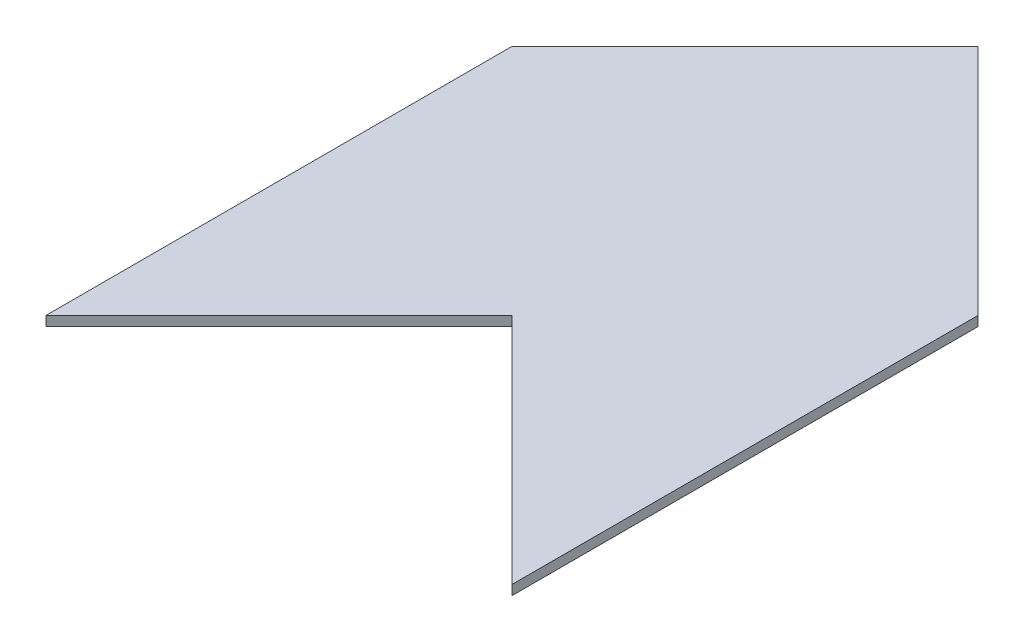
ISO-10303-21;
HEADER;
FILE_DESCRIPTION(('STEP AP214'),'2;1');
FILE_NAME('part.step','',(''),(''),'','','');
FILE_SCHEMA(('AUTOMOTIVE_DESIGN { 1 0 10303 214 1 1 1 1 }'));
ENDSEC;
DATA;
#1=APPLICATION_CONTEXT('core data for automotive mechanical design processes');
#2=APPLICATION_PROTOCOL_DEFINITION('international standard','automotive_design',2000,#1);
#3=PRODUCT_CONTEXT('',#1,'mechanical');
#4=PRODUCT('Part','Part','',(#3));
#5=PRODUCT_RELATED_PRODUCT_CATEGORY('part','',(#4));
#6=PRODUCT_DEFINITION_FORMATION('','',#4);
#7=PRODUCT_DEFINITION_CONTEXT('part definition',#1,'design');
#8=PRODUCT_DEFINITION('design','',#6,#7);
#9=PRODUCT_DEFINITION_SHAPE('','',#8);
#10=(LENGTH_UNIT() NAMED_UNIT(*) SI_UNIT(.MILLI.,.METRE.));
#11=(NAMED_UNIT(*) PLANE_ANGLE_UNIT() SI_UNIT($,.RADIAN.));
#12=(NAMED_UNIT(*) SI_UNIT($,.STERADIAN.) SOLID_ANGLE_UNIT());
#13=UNCERTAINTY_MEASURE_WITH_UNIT(LENGTH_MEASURE(1.E-05),#10,'distance_accuracy_value','');
#14=(GEOMETRIC_REPRESENTATION_CONTEXT(3) GLOBAL_UNCERTAINTY_ASSIGNED_CONTEXT((#13)) GLOBAL_UNIT_ASSIGNED_CONTEXT((#10,
#11,#12)) REPRESENTATION_CONTEXT('',''));
#15=CARTESIAN_POINT('',(0.,0.,0.));
#16=DIRECTION('',(0.,0.,1.));
#17=DIRECTION('',(1.,0.,0.));
#18=AXIS2_PLACEMENT_3D('',#15,#16,#17);
#19=CARTESIAN_POINT('',(0.,3.175,0.));
#20=DIRECTION('',(-0.707106781186548,0.,-0.707106781186548));
#21=DIRECTION('',(-0.707106781186548,0.,0.707106781186548));
#22=AXIS2_PLACEMENT_3D('',#19,#20,#21);
#23=PLANE('',#22);
#24=DIRECTION('',(0.707106781186547,0.,-0.707106781186547));
#25=VECTOR('',#24,1.);
#26=CARTESIAN_POINT('',(0.,0.,0.));
#27=LINE('',#26,#25);
#28=CARTESIAN_POINT('',(-76.2,0.,76.2));
#29=VERTEX_POINT('',#28);
#30=CARTESIAN_POINT('',(0.,0.,0.));
#31=VERTEX_POINT('',#30);
#32=EDGE_CURVE('E116',#29,#31,#27,.T.);
#33=ORIENTED_EDGE('',*,*,#32,.T.);
#34=DIRECTION('',(0.,-1.,0.));
#35=VECTOR('',#34,1.);
#36=CARTESIAN_POINT('',(0.,3.175,0.));
#37=LINE('',#36,#35);
#38=CARTESIAN_POINT('',(0.,3.175,0.));
#39=VERTEX_POINT('',#38);
#40=EDGE_CURVE('E11',#39,#31,#37,.T.);
#41=ORIENTED_EDGE('',*,*,#40,.F.);
#42=DIRECTION('',(0.707106781186547,0.,-0.707106781186547));
#43=VECTOR('',#42,1.);
#44=CARTESIAN_POINT('',(0.,3.175,0.));
#45=LINE('',#44,#43);
#46=CARTESIAN_POINT('',(-76.2,3.175,76.2));
#47=VERTEX_POINT('',#46);
#48=EDGE_CURVE('E126',#47,#39,#45,.T.);
#49=ORIENTED_EDGE('',*,*,#48,.F.);
#50=DIRECTION('',(0.,-1.,0.));
#51=VECTOR('',#50,1.);
#52=CARTESIAN_POINT('',(-76.2,3.175,76.2));
#53=LINE('',#52,#51);
#54=EDGE_CURVE('E112',#47,#29,#53,.T.);
#55=ORIENTED_EDGE('',*,*,#54,.T.);
#56=EDGE_LOOP('',(#33,#41,#49,#55));
#57=FACE_BOUND('',#56,.T.);
#58=ADVANCED_FACE('F32',(#57),#23,.F.);
#59=CARTESIAN_POINT('',(0.,3.175,0.));
#60=DIRECTION('',(0.707106781186548,0.,-0.707106781186548));
#61=DIRECTION('',(-0.707106781186548,0.,-0.707106781186548));
#62=AXIS2_PLACEMENT_3D('',#59,#60,#61);
#63=PLANE('',#62);
#64=DIRECTION('',(0.707106781186547,0.,0.707106781186547));
#65=VECTOR('',#64,1.);
#66=CARTESIAN_POINT('',(0.,0.,0.));
#67=LINE('',#66,#65);
#68=CARTESIAN_POINT('',(76.2,0.,76.2));
#69=VERTEX_POINT('',#68);
#70=EDGE_CURVE('E119',#31,#69,#67,.T.);
#71=ORIENTED_EDGE('',*,*,#70,.T.);
#72=DIRECTION('',(0.,-1.,0.));
#73=VECTOR('',#72,1.);
#74=CARTESIAN_POINT('',(76.2,3.175,76.2));
#75=LINE('',#74,#73);
#76=CARTESIAN_POINT('',(76.2,3.175,76.2));
#77=VERTEX_POINT('',#76);
#78=EDGE_CURVE('E40',#77,#69,#75,.T.);
#79=ORIENTED_EDGE('',*,*,#78,.F.);
#80=DIRECTION('',(0.707106781186547,0.,0.707106781186547));
#81=VECTOR('',#80,1.);
#82=CARTESIAN_POINT('',(0.,3.175,0.));
#83=LINE('',#82,#81);
#84=EDGE_CURVE('E85',#39,#77,#83,.T.);
#85=ORIENTED_EDGE('',*,*,#84,.F.);
#86=ORIENTED_EDGE('',*,*,#40,.T.);
#87=EDGE_LOOP('',(#71,#79,#85,#86));
#88=FACE_BOUND('',#87,.T.);
#89=ADVANCED_FACE('F150',(#88),#63,.F.);
#90=CARTESIAN_POINT('',(76.2,3.175,76.2));
#91=DIRECTION('',(-1.,0.,0.));
#92=DIRECTION('',(0.,0.,1.));
#93=AXIS2_PLACEMENT_3D('',#90,#91,#92);
#94=PLANE('',#93);
#95=DIRECTION('',(0.,0.,-1.));
#96=VECTOR('',#95,1.);
#97=CARTESIAN_POINT('',(76.2,0.,76.2));
#98=LINE('',#97,#96);
#99=CARTESIAN_POINT('',(76.2,0.,-76.2));
#100=VERTEX_POINT('',#99);
#101=EDGE_CURVE('E121',#69,#100,#98,.T.);
#102=ORIENTED_EDGE('',*,*,#101,.T.);
#103=DIRECTION('',(0.,-1.,0.));
#104=VECTOR('',#103,1.);
#105=CARTESIAN_POINT('',(76.2,3.175,-76.2));
#106=LINE('',#105,#104);
#107=CARTESIAN_POINT('',(76.2,3.175,-76.2));
#108=VERTEX_POINT('',#107);
#109=EDGE_CURVE('E107',#108,#100,#106,.T.);
#110=ORIENTED_EDGE('',*,*,#109,.F.);
#111=DIRECTION('',(0.,0.,-1.));
#112=VECTOR('',#111,1.);
#113=CARTESIAN_POINT('',(76.2,3.175,76.2));
#114=LINE('',#113,#112);
#115=EDGE_CURVE('E98',#77,#108,#114,.T.);
#116=ORIENTED_EDGE('',*,*,#115,.F.);
#117=ORIENTED_EDGE('',*,*,#78,.T.);
#118=EDGE_LOOP('',(#102,#110,#116,#117));
#119=FACE_BOUND('',#118,.T.);
#120=ADVANCED_FACE('F132',(#119),#94,.F.);
#121=CARTESIAN_POINT('',(76.2,3.175,-76.2));
#122=DIRECTION('',(-0.707106781186548,0.,0.707106781186548));
#123=DIRECTION('',(0.707106781186547,0.,0.707106781186548));
#124=AXIS2_PLACEMENT_3D('',#121,#122,#123);
#125=PLANE('',#124);
#126=DIRECTION('',(-0.707106781186547,0.,-0.707106781186547));
#127=VECTOR('',#126,1.);
#128=CARTESIAN_POINT('',(76.2,0.,-76.2));
#129=LINE('',#128,#127);
#130=CARTESIAN_POINT('',(0.,0.,-152.4));
#131=VERTEX_POINT('',#130);
#132=EDGE_CURVE('E106',#100,#131,#129,.T.);
#133=ORIENTED_EDGE('',*,*,#132,.T.);
#134=DIRECTION('',(0.,-1.,0.));
#135=VECTOR('',#134,1.);
#136=CARTESIAN_POINT('',(0.,3.175,-152.4));
#137=LINE('',#136,#135);
#138=CARTESIAN_POINT('',(0.,3.175,-152.4));
#139=VERTEX_POINT('',#138);
#140=EDGE_CURVE('E103',#139,#131,#137,.T.);
#141=ORIENTED_EDGE('',*,*,#140,.F.);
#142=DIRECTION('',(-0.707106781186547,0.,-0.707106781186547));
#143=VECTOR('',#142,1.);
#144=CARTESIAN_POINT('',(76.2,3.175,-76.2));
#145=LINE('',#144,#143);
#146=EDGE_CURVE('E92',#108,#139,#145,.T.);
#147=ORIENTED_EDGE('',*,*,#146,.F.);
#148=ORIENTED_EDGE('',*,*,#109,.T.);
#149=EDGE_LOOP('',(#133,#141,#147,#148));
#150=FACE_BOUND('',#149,.T.);
#151=ADVANCED_FACE('F104',(#150),#125,.F.);
#152=CARTESIAN_POINT('',(-76.2,3.175,-76.2));
#153=DIRECTION('',(0.707106781186548,0.,0.707106781186548));
#154=DIRECTION('',(0.707106781186547,0.,-0.707106781186548));
#155=AXIS2_PLACEMENT_3D('',#152,#153,#154);
#156=PLANE('',#155);
#157=DIRECTION('',(-0.707106781186547,0.,0.707106781186547));
#158=VECTOR('',#157,1.);
#159=CARTESIAN_POINT('',(-76.2,0.,-76.2));
#160=LINE('',#159,#158);
#161=CARTESIAN_POINT('',(-76.2,0.,-76.2));
#162=VERTEX_POINT('',#161);
#163=EDGE_CURVE('E71',#131,#162,#160,.T.);
#164=ORIENTED_EDGE('',*,*,#163,.T.);
#165=DIRECTION('',(0.,-1.,0.));
#166=VECTOR('',#165,1.);
#167=CARTESIAN_POINT('',(-76.2,3.175,-76.2));
#168=LINE('',#167,#166);
#169=CARTESIAN_POINT('',(-76.2,3.175,-76.2));
#170=VERTEX_POINT('',#169);
#171=EDGE_CURVE('E108',#170,#162,#168,.T.);
#172=ORIENTED_EDGE('',*,*,#171,.F.);
#173=DIRECTION('',(-0.707106781186547,0.,0.707106781186547));
#174=VECTOR('',#173,1.);
#175=CARTESIAN_POINT('',(-76.2,3.175,-76.2));
#176=LINE('',#175,#174);
#177=EDGE_CURVE('E96',#139,#170,#176,.T.);
#178=ORIENTED_EDGE('',*,*,#177,.F.);
#179=ORIENTED_EDGE('',*,*,#140,.T.);
#180=EDGE_LOOP('',(#164,#172,#178,#179));
#181=FACE_BOUND('',#180,.T.);
#182=ADVANCED_FACE('F110',(#181),#156,.F.);
#183=CARTESIAN_POINT('',(-76.2,3.175,76.2));
#184=DIRECTION('',(1.,0.,0.));
#185=DIRECTION('',(0.,0.,-1.));
#186=AXIS2_PLACEMENT_3D('',#183,#184,#185);
#187=PLANE('',#186);
#188=DIRECTION('',(0.,0.,1.));
#189=VECTOR('',#188,1.);
#190=CARTESIAN_POINT('',(-76.2,0.,76.2));
#191=LINE('',#190,#189);
#192=EDGE_CURVE('E77',#162,#29,#191,.T.);
#193=ORIENTED_EDGE('',*,*,#192,.T.);
#194=ORIENTED_EDGE('',*,*,#54,.F.);
#195=DIRECTION('',(0.,0.,1.));
#196=VECTOR('',#195,1.);
#197=CARTESIAN_POINT('',(-76.2,3.175,76.2));
#198=LINE('',#197,#196);
#199=EDGE_CURVE('E48',#170,#47,#198,.T.);
#200=ORIENTED_EDGE('',*,*,#199,.F.);
#201=ORIENTED_EDGE('',*,*,#171,.T.);
#202=EDGE_LOOP('',(#193,#194,#200,#201));
#203=FACE_BOUND('',#202,.T.);
#204=ADVANCED_FACE('F139',(#203),#187,.F.);
#205=CARTESIAN_POINT('',(0.,3.175,0.));
#206=DIRECTION('',(0.,-1.,0.));
#207=DIRECTION('',(0.,0.,-1.));
#208=AXIS2_PLACEMENT_3D('',#205,#206,#207);
#209=PLANE('',#208);
#210=ORIENTED_EDGE('',*,*,#48,.T.);
#211=ORIENTED_EDGE('',*,*,#84,.T.);
#212=ORIENTED_EDGE('',*,*,#115,.T.);
#213=ORIENTED_EDGE('',*,*,#146,.T.);
#214=ORIENTED_EDGE('',*,*,#177,.T.);
#215=ORIENTED_EDGE('',*,*,#199,.T.);
#216=EDGE_LOOP('',(#210,#211,#212,#213,#214,#215));
#217=FACE_BOUND('',#216,.T.);
#218=ADVANCED_FACE('F94',(#217),#209,.F.);
#219=CARTESIAN_POINT('',(0.,0.,0.));
#220=DIRECTION('',(0.,-1.,0.));
#221=DIRECTION('',(0.,0.,-1.));
#222=AXIS2_PLACEMENT_3D('',#219,#220,#221);
#223=PLANE('',#222);
#224=ORIENTED_EDGE('',*,*,#32,.F.);
#225=ORIENTED_EDGE('',*,*,#192,.F.);
#226=ORIENTED_EDGE('',*,*,#163,.F.);
#227=ORIENTED_EDGE('',*,*,#132,.F.);
#228=ORIENTED_EDGE('',*,*,#101,.F.);
#229=ORIENTED_EDGE('',*,*,#70,.F.);
#230=EDGE_LOOP('',(#224,#225,#226,#227,#228,#229));
#231=FACE_BOUND('',#230,.T.);
#232=ADVANCED_FACE('F135',(#231),#223,.T.);
#233=CLOSED_SHELL('',(#58,#89,#120,#151,#182,#204,#218,#232));
#234=MANIFOLD_SOLID_BREP('B2',#233);
#235=ADVANCED_BREP_SHAPE_REPRESENTATION('',(#18,#234),#14);
#236=SHAPE_DEFINITION_REPRESENTATION(#9,#235);
ENDSEC;
END-ISO-10303-21;
